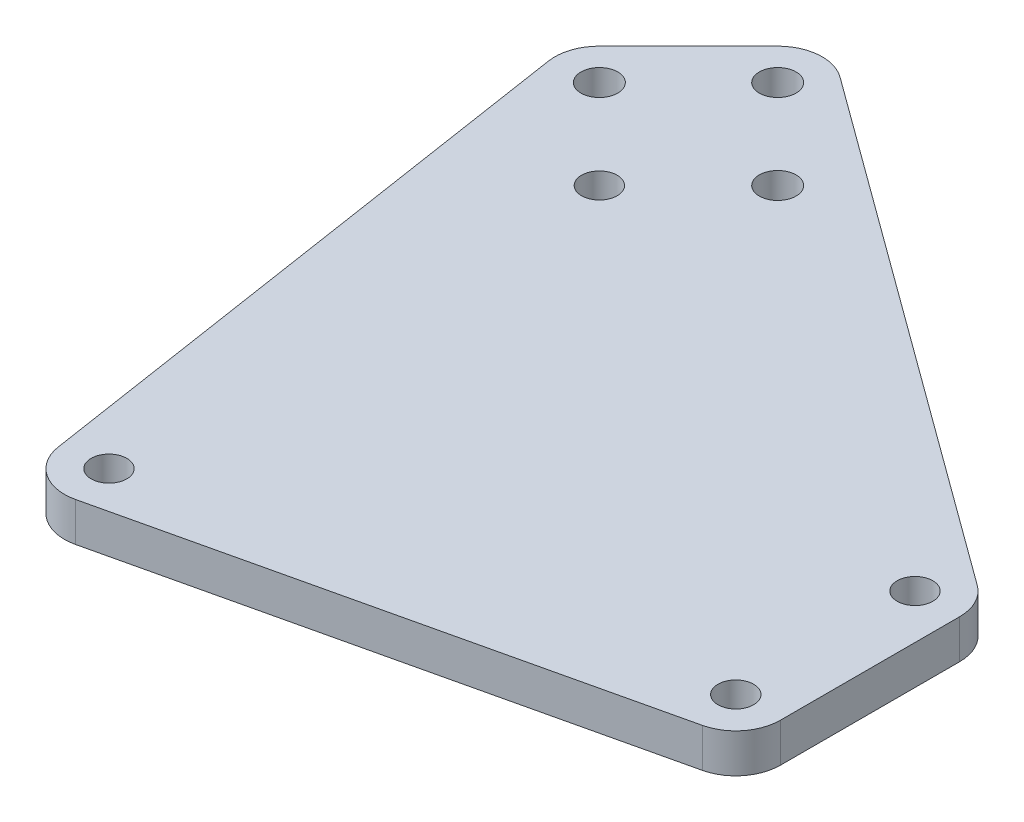
ISO-10303-21;
HEADER;
FILE_DESCRIPTION(('STEP AP214'),'2;1');
FILE_NAME('part.step','',(''),(''),'','','');
FILE_SCHEMA(('AUTOMOTIVE_DESIGN { 1 0 10303 214 1 1 1 1 }'));
ENDSEC;
DATA;
#1=APPLICATION_CONTEXT('core data for automotive mechanical design processes');
#2=APPLICATION_PROTOCOL_DEFINITION('international standard','automotive_design',2000,#1);
#3=PRODUCT_CONTEXT('',#1,'mechanical');
#4=PRODUCT('Part','Part','',(#3));
#5=PRODUCT_RELATED_PRODUCT_CATEGORY('part','',(#4));
#6=PRODUCT_DEFINITION_FORMATION('','',#4);
#7=PRODUCT_DEFINITION_CONTEXT('part definition',#1,'design');
#8=PRODUCT_DEFINITION('design','',#6,#7);
#9=PRODUCT_DEFINITION_SHAPE('','',#8);
#10=(LENGTH_UNIT() NAMED_UNIT(*) SI_UNIT(.MILLI.,.METRE.));
#11=(NAMED_UNIT(*) PLANE_ANGLE_UNIT() SI_UNIT($,.RADIAN.));
#12=(NAMED_UNIT(*) SI_UNIT($,.STERADIAN.) SOLID_ANGLE_UNIT());
#13=UNCERTAINTY_MEASURE_WITH_UNIT(LENGTH_MEASURE(1.E-05),#10,'distance_accuracy_value','');
#14=(GEOMETRIC_REPRESENTATION_CONTEXT(3) GLOBAL_UNCERTAINTY_ASSIGNED_CONTEXT((#13)) GLOBAL_UNIT_ASSIGNED_CONTEXT((#10,
#11,#12)) REPRESENTATION_CONTEXT('',''));
#15=CARTESIAN_POINT('',(0.,0.,0.));
#16=DIRECTION('',(0.,0.,1.));
#17=DIRECTION('',(1.,0.,0.));
#18=AXIS2_PLACEMENT_3D('',#15,#16,#17);
#19=CARTESIAN_POINT('',(8348.96943647229,3.5,-3114.41158300691));
#20=DIRECTION('',(0.,1.,0.));
#21=DIRECTION('',(0.,0.,1.));
#22=AXIS2_PLACEMENT_3D('',#19,#20,#21);
#23=PLANE('',#22);
#24=CARTESIAN_POINT('',(8295.29784933292,3.5,-3139.76378876024));
#25=DIRECTION('',(0.,1.,0.));
#26=DIRECTION('',(0.,0.,1.));
#27=AXIS2_PLACEMENT_3D('',#24,#25,#26);
#28=CIRCLE('',#27,1.65000000000019);
#29=CARTESIAN_POINT('',(8295.29784933292,3.5,-3138.11378876024));
#30=VERTEX_POINT('',#29);
#31=EDGE_CURVE('E287',#30,#30,#28,.T.);
#32=ORIENTED_EDGE('',*,*,#31,.F.);
#33=EDGE_LOOP('',(#32));
#34=FACE_BOUND('',#33,.T.);
#35=CARTESIAN_POINT('',(8303.29784933292,3.5,-3131.76378876024));
#36=DIRECTION('',(0.,1.,0.));
#37=DIRECTION('',(0.,0.,1.));
#38=AXIS2_PLACEMENT_3D('',#35,#36,#37);
#39=CIRCLE('',#38,1.59999999999982);
#40=CARTESIAN_POINT('',(8303.29784933292,3.5,-3130.16378876024));
#41=VERTEX_POINT('',#40);
#42=EDGE_CURVE('E271',#41,#41,#39,.T.);
#43=ORIENTED_EDGE('',*,*,#42,.F.);
#44=EDGE_LOOP('',(#43));
#45=FACE_BOUND('',#44,.T.);
#46=CARTESIAN_POINT('',(8348.96943647229,3.5,-3098.33238226228));
#47=DIRECTION('',(0.,1.,0.));
#48=DIRECTION('',(0.,0.,1.));
#49=AXIS2_PLACEMENT_3D('',#46,#47,#48);
#50=CIRCLE('',#49,1.59999999999982);
#51=CARTESIAN_POINT('',(8348.96943647229,3.5,-3096.73238226228));
#52=VERTEX_POINT('',#51);
#53=EDGE_CURVE('E255',#52,#52,#50,.T.);
#54=ORIENTED_EDGE('',*,*,#53,.F.);
#55=EDGE_LOOP('',(#54));
#56=FACE_BOUND('',#55,.T.);
#57=CARTESIAN_POINT('',(8348.96943647229,3.5,-3114.41158300691));
#58=DIRECTION('',(0.,1.,0.));
#59=DIRECTION('',(0.,0.,1.));
#60=AXIS2_PLACEMENT_3D('',#57,#58,#59);
#61=CIRCLE('',#60,3.99999999999791);
#62=CARTESIAN_POINT('',(8352.96943647229,3.5,-3114.41158300691));
#63=VERTEX_POINT('',#62);
#64=CARTESIAN_POINT('',(8351.32843370685,3.5,-3117.64192850659));
#65=VERTEX_POINT('',#64);
#66=EDGE_CURVE('E188',#63,#65,#61,.T.);
#67=ORIENTED_EDGE('',*,*,#66,.T.);
#68=DIRECTION('',(-0.807586374921076,0.,-0.589749308640405));
#69=VECTOR('',#68,1.);
#70=CARTESIAN_POINT('',(8305.65684656748,3.5,-3150.99413425992));
#71=LINE('',#70,#69);
#72=CARTESIAN_POINT('',(8305.65684656748,3.5,-3150.99413425992));
#73=VERTEX_POINT('',#72);
#74=EDGE_CURVE('E112',#65,#73,#71,.T.);
#75=ORIENTED_EDGE('',*,*,#74,.T.);
#76=CARTESIAN_POINT('',(8303.29784933292,3.5,-3147.76378876024));
#77=DIRECTION('',(0.,1.,0.));
#78=DIRECTION('',(0.,0.,1.));
#79=AXIS2_PLACEMENT_3D('',#76,#77,#78);
#80=CIRCLE('',#79,4.00000000000042);
#81=CARTESIAN_POINT('',(8300.46942220818,3.5,-3150.59221588498));
#82=VERTEX_POINT('',#81);
#83=EDGE_CURVE('E217',#73,#82,#80,.T.);
#84=ORIENTED_EDGE('',*,*,#83,.T.);
#85=DIRECTION('',(-0.707106781186469,0.,0.707106781186626));
#86=VECTOR('',#85,1.);
#87=CARTESIAN_POINT('',(8292.46942220817,3.5,-3142.59221588498));
#88=LINE('',#87,#86);
#89=CARTESIAN_POINT('',(8292.46942220817,3.5,-3142.59221588498));
#90=VERTEX_POINT('',#89);
#91=EDGE_CURVE('E237',#82,#90,#88,.T.);
#92=ORIENTED_EDGE('',*,*,#91,.T.);
#93=CARTESIAN_POINT('',(8295.29784933292,3.5,-3139.76378876024));
#94=DIRECTION('',(0.,1.,0.));
#95=DIRECTION('',(0.,0.,1.));
#96=AXIS2_PLACEMENT_3D('',#93,#94,#95);
#97=CIRCLE('',#96,4.00000000000107);
#98=CARTESIAN_POINT('',(8291.34436254232,3.5,-3139.15556002322));
#99=VERTEX_POINT('',#98);
#100=EDGE_CURVE('E233',#90,#99,#97,.T.);
#101=ORIENTED_EDGE('',*,*,#100,.T.);
#102=DIRECTION('',(0.152057184253925,0.,0.98837169765062));
#103=VECTOR('',#102,1.);
#104=CARTESIAN_POINT('',(8291.34436254232,3.5,-3139.15556002322));
#105=LINE('',#104,#103);
#106=CARTESIAN_POINT('',(8299.34436254232,3.5,-3087.15556002322));
#107=VERTEX_POINT('',#106);
#108=EDGE_CURVE('E236',#99,#107,#105,.T.);
#109=ORIENTED_EDGE('',*,*,#108,.T.);
#110=CARTESIAN_POINT('',(8303.29784933292,3.5,-3087.76378876024));
#111=DIRECTION('',(0.,1.,0.));
#112=DIRECTION('',(0.,0.,1.));
#113=AXIS2_PLACEMENT_3D('',#110,#111,#112);
#114=CIRCLE('',#113,4.00000000000045);
#115=CARTESIAN_POINT('',(8304.19963628055,3.5,-3083.86676678171));
#116=VERTEX_POINT('',#115);
#117=EDGE_CURVE('E137',#107,#116,#114,.T.);
#118=ORIENTED_EDGE('',*,*,#117,.T.);
#119=DIRECTION('',(0.974255494630878,0.,-0.225446736905954));
#120=VECTOR('',#119,1.);
#121=CARTESIAN_POINT('',(8304.19963628055,3.5,-3083.86676678171));
#122=LINE('',#121,#120);
#123=CARTESIAN_POINT('',(8349.87122341991,3.5,-3094.43536028376));
#124=VERTEX_POINT('',#123);
#125=EDGE_CURVE('E131',#116,#124,#122,.T.);
#126=ORIENTED_EDGE('',*,*,#125,.T.);
#127=CARTESIAN_POINT('',(8348.96943647229,3.5,-3098.33238226228));
#128=DIRECTION('',(0.,1.,0.));
#129=DIRECTION('',(0.,0.,1.));
#130=AXIS2_PLACEMENT_3D('',#127,#128,#129);
#131=CIRCLE('',#130,3.9999999999997);
#132=CARTESIAN_POINT('',(8352.96943647229,3.5,-3098.33238226228));
#133=VERTEX_POINT('',#132);
#134=EDGE_CURVE('E135',#124,#133,#131,.T.);
#135=ORIENTED_EDGE('',*,*,#134,.T.);
#136=DIRECTION('',(0.,0.,-1.));
#137=VECTOR('',#136,1.);
#138=CARTESIAN_POINT('',(8352.96943647229,3.5,-3098.33238226228));
#139=LINE('',#138,#137);
#140=EDGE_CURVE('E63',#133,#63,#139,.T.);
#141=ORIENTED_EDGE('',*,*,#140,.T.);
#142=EDGE_LOOP('',(#67,#75,#84,#92,#101,#109,#118,#126,#135,#141));
#143=FACE_BOUND('',#142,.T.);
#144=CARTESIAN_POINT('',(8303.29784933292,3.5,-3147.76378876024));
#145=DIRECTION('',(0.,1.,0.));
#146=DIRECTION('',(0.,0.,1.));
#147=AXIS2_PLACEMENT_3D('',#144,#145,#146);
#148=CIRCLE('',#147,1.65000000000019);
#149=CARTESIAN_POINT('',(8303.29784933292,3.5,-3146.11378876024));
#150=VERTEX_POINT('',#149);
#151=EDGE_CURVE('E164',#150,#150,#148,.T.);
#152=ORIENTED_EDGE('',*,*,#151,.F.);
#153=EDGE_LOOP('',(#152));
#154=FACE_BOUND('',#153,.T.);
#155=CARTESIAN_POINT('',(8348.96943647229,3.5,-3114.41158300691));
#156=DIRECTION('',(0.,1.,0.));
#157=DIRECTION('',(0.,0.,1.));
#158=AXIS2_PLACEMENT_3D('',#155,#156,#157);
#159=CIRCLE('',#158,1.59999999999982);
#160=CARTESIAN_POINT('',(8348.96943647229,3.5,-3112.81158300691));
#161=VERTEX_POINT('',#160);
#162=EDGE_CURVE('E263',#161,#161,#159,.T.);
#163=ORIENTED_EDGE('',*,*,#162,.F.);
#164=EDGE_LOOP('',(#163));
#165=FACE_BOUND('',#164,.T.);
#166=CARTESIAN_POINT('',(8303.29784933292,3.5,-3087.76378876024));
#167=DIRECTION('',(0.,1.,0.));
#168=DIRECTION('',(0.,0.,1.));
#169=AXIS2_PLACEMENT_3D('',#166,#167,#168);
#170=CIRCLE('',#169,1.59999999999982);
#171=CARTESIAN_POINT('',(8303.29784933292,3.5,-3086.16378876024));
#172=VERTEX_POINT('',#171);
#173=EDGE_CURVE('E279',#172,#172,#170,.T.);
#174=ORIENTED_EDGE('',*,*,#173,.F.);
#175=EDGE_LOOP('',(#174));
#176=FACE_BOUND('',#175,.T.);
#177=CARTESIAN_POINT('',(8311.29784933292,3.5,-3139.76378876024));
#178=DIRECTION('',(0.,1.,0.));
#179=DIRECTION('',(0.,0.,1.));
#180=AXIS2_PLACEMENT_3D('',#177,#178,#179);
#181=CIRCLE('',#180,1.65000000000019);
#182=CARTESIAN_POINT('',(8311.29784933292,3.5,-3138.11378876024));
#183=VERTEX_POINT('',#182);
#184=EDGE_CURVE('E295',#183,#183,#181,.T.);
#185=ORIENTED_EDGE('',*,*,#184,.F.);
#186=EDGE_LOOP('',(#185));
#187=FACE_BOUND('',#186,.T.);
#188=ADVANCED_FACE('F45',(#34,#45,#56,#143,#154,#165,#176,#187),#23,.T.);
#189=CARTESIAN_POINT('',(8348.96943647229,0.,-3114.41158300691));
#190=DIRECTION('',(0.,1.,0.));
#191=DIRECTION('',(0.,0.,1.));
#192=AXIS2_PLACEMENT_3D('',#189,#190,#191);
#193=PLANE('',#192);
#194=CARTESIAN_POINT('',(8348.96943647229,0.,-3114.41158300691));
#195=DIRECTION('',(0.,1.,0.));
#196=DIRECTION('',(0.,0.,1.));
#197=AXIS2_PLACEMENT_3D('',#194,#195,#196);
#198=CIRCLE('',#197,3.99999999999791);
#199=CARTESIAN_POINT('',(8352.96943647229,0.,-3114.41158300691));
#200=VERTEX_POINT('',#199);
#201=CARTESIAN_POINT('',(8351.32843370685,0.,-3117.64192850659));
#202=VERTEX_POINT('',#201);
#203=EDGE_CURVE('E159',#200,#202,#198,.T.);
#204=ORIENTED_EDGE('',*,*,#203,.F.);
#205=DIRECTION('',(0.,0.,-1.));
#206=VECTOR('',#205,1.);
#207=CARTESIAN_POINT('',(8352.96943647229,0.,-3098.33238226228));
#208=LINE('',#207,#206);
#209=CARTESIAN_POINT('',(8352.96943647229,0.,-3098.33238226228));
#210=VERTEX_POINT('',#209);
#211=EDGE_CURVE('E104',#210,#200,#208,.T.);
#212=ORIENTED_EDGE('',*,*,#211,.F.);
#213=CARTESIAN_POINT('',(8348.96943647229,0.,-3098.33238226228));
#214=DIRECTION('',(0.,1.,0.));
#215=DIRECTION('',(0.,0.,1.));
#216=AXIS2_PLACEMENT_3D('',#213,#214,#215);
#217=CIRCLE('',#216,3.9999999999997);
#218=CARTESIAN_POINT('',(8349.87122341991,0.,-3094.43536028376));
#219=VERTEX_POINT('',#218);
#220=EDGE_CURVE('E98',#219,#210,#217,.T.);
#221=ORIENTED_EDGE('',*,*,#220,.F.);
#222=DIRECTION('',(0.974255494630878,0.,-0.225446736905954));
#223=VECTOR('',#222,1.);
#224=CARTESIAN_POINT('',(8304.19963628055,0.,-3083.86676678171));
#225=LINE('',#224,#223);
#226=CARTESIAN_POINT('',(8304.19963628055,0.,-3083.86676678171));
#227=VERTEX_POINT('',#226);
#228=EDGE_CURVE('E146',#227,#219,#225,.T.);
#229=ORIENTED_EDGE('',*,*,#228,.F.);
#230=CARTESIAN_POINT('',(8303.29784933292,0.,-3087.76378876024));
#231=DIRECTION('',(0.,1.,0.));
#232=DIRECTION('',(0.,0.,1.));
#233=AXIS2_PLACEMENT_3D('',#230,#231,#232);
#234=CIRCLE('',#233,4.00000000000045);
#235=CARTESIAN_POINT('',(8299.34436254232,0.,-3087.15556002322));
#236=VERTEX_POINT('',#235);
#237=EDGE_CURVE('E179',#236,#227,#234,.T.);
#238=ORIENTED_EDGE('',*,*,#237,.F.);
#239=DIRECTION('',(0.152057184253925,0.,0.98837169765062));
#240=VECTOR('',#239,1.);
#241=CARTESIAN_POINT('',(8291.34436254232,0.,-3139.15556002322));
#242=LINE('',#241,#240);
#243=CARTESIAN_POINT('',(8291.34436254232,0.,-3139.15556002322));
#244=VERTEX_POINT('',#243);
#245=EDGE_CURVE('E176',#244,#236,#242,.T.);
#246=ORIENTED_EDGE('',*,*,#245,.F.);
#247=CARTESIAN_POINT('',(8295.29784933292,0.,-3139.76378876024));
#248=DIRECTION('',(0.,1.,0.));
#249=DIRECTION('',(0.,0.,1.));
#250=AXIS2_PLACEMENT_3D('',#247,#248,#249);
#251=CIRCLE('',#250,4.00000000000107);
#252=CARTESIAN_POINT('',(8292.46942220817,0.,-3142.59221588498));
#253=VERTEX_POINT('',#252);
#254=EDGE_CURVE('E173',#253,#244,#251,.T.);
#255=ORIENTED_EDGE('',*,*,#254,.F.);
#256=DIRECTION('',(-0.707106781186469,0.,0.707106781186626));
#257=VECTOR('',#256,1.);
#258=CARTESIAN_POINT('',(8292.46942220817,0.,-3142.59221588498));
#259=LINE('',#258,#257);
#260=CARTESIAN_POINT('',(8300.46942220818,0.,-3150.59221588498));
#261=VERTEX_POINT('',#260);
#262=EDGE_CURVE('E170',#261,#253,#259,.T.);
#263=ORIENTED_EDGE('',*,*,#262,.F.);
#264=CARTESIAN_POINT('',(8303.29784933292,0.,-3147.76378876024));
#265=DIRECTION('',(0.,1.,0.));
#266=DIRECTION('',(0.,0.,1.));
#267=AXIS2_PLACEMENT_3D('',#264,#265,#266);
#268=CIRCLE('',#267,4.00000000000042);
#269=CARTESIAN_POINT('',(8305.65684656748,0.,-3150.99413425992));
#270=VERTEX_POINT('',#269);
#271=EDGE_CURVE('E167',#270,#261,#268,.T.);
#272=ORIENTED_EDGE('',*,*,#271,.F.);
#273=DIRECTION('',(-0.807586374921076,0.,-0.589749308640405));
#274=VECTOR('',#273,1.);
#275=CARTESIAN_POINT('',(8305.65684656748,0.,-3150.99413425992));
#276=LINE('',#275,#274);
#277=EDGE_CURVE('E163',#202,#270,#276,.T.);
#278=ORIENTED_EDGE('',*,*,#277,.F.);
#279=EDGE_LOOP('',(#204,#212,#221,#229,#238,#246,#255,#263,#272,#278));
#280=FACE_BOUND('',#279,.T.);
#281=CARTESIAN_POINT('',(8303.29784933292,0.,-3147.76378876024));
#282=DIRECTION('',(0.,1.,0.));
#283=DIRECTION('',(0.,0.,1.));
#284=AXIS2_PLACEMENT_3D('',#281,#282,#283);
#285=CIRCLE('',#284,1.65000000000019);
#286=CARTESIAN_POINT('',(8303.29784933292,0.,-3146.11378876024));
#287=VERTEX_POINT('',#286);
#288=EDGE_CURVE('E251',#287,#287,#285,.T.);
#289=ORIENTED_EDGE('',*,*,#288,.T.);
#290=EDGE_LOOP('',(#289));
#291=FACE_BOUND('',#290,.T.);
#292=CARTESIAN_POINT('',(8348.96943647229,0.,-3098.33238226228));
#293=DIRECTION('',(0.,1.,0.));
#294=DIRECTION('',(0.,0.,1.));
#295=AXIS2_PLACEMENT_3D('',#292,#293,#294);
#296=CIRCLE('',#295,1.59999999999982);
#297=CARTESIAN_POINT('',(8348.96943647229,0.,-3096.73238226228));
#298=VERTEX_POINT('',#297);
#299=EDGE_CURVE('E259',#298,#298,#296,.T.);
#300=ORIENTED_EDGE('',*,*,#299,.T.);
#301=EDGE_LOOP('',(#300));
#302=FACE_BOUND('',#301,.T.);
#303=CARTESIAN_POINT('',(8348.96943647229,0.,-3114.41158300691));
#304=DIRECTION('',(0.,1.,0.));
#305=DIRECTION('',(0.,0.,1.));
#306=AXIS2_PLACEMENT_3D('',#303,#304,#305);
#307=CIRCLE('',#306,1.59999999999982);
#308=CARTESIAN_POINT('',(8348.96943647229,0.,-3112.81158300691));
#309=VERTEX_POINT('',#308);
#310=EDGE_CURVE('E267',#309,#309,#307,.T.);
#311=ORIENTED_EDGE('',*,*,#310,.T.);
#312=EDGE_LOOP('',(#311));
#313=FACE_BOUND('',#312,.T.);
#314=CARTESIAN_POINT('',(8303.29784933292,0.,-3131.76378876024));
#315=DIRECTION('',(0.,1.,0.));
#316=DIRECTION('',(0.,0.,1.));
#317=AXIS2_PLACEMENT_3D('',#314,#315,#316);
#318=CIRCLE('',#317,1.59999999999982);
#319=CARTESIAN_POINT('',(8303.29784933292,0.,-3130.16378876024));
#320=VERTEX_POINT('',#319);
#321=EDGE_CURVE('E275',#320,#320,#318,.T.);
#322=ORIENTED_EDGE('',*,*,#321,.T.);
#323=EDGE_LOOP('',(#322));
#324=FACE_BOUND('',#323,.T.);
#325=CARTESIAN_POINT('',(8303.29784933292,0.,-3087.76378876024));
#326=DIRECTION('',(0.,1.,0.));
#327=DIRECTION('',(0.,0.,1.));
#328=AXIS2_PLACEMENT_3D('',#325,#326,#327);
#329=CIRCLE('',#328,1.59999999999982);
#330=CARTESIAN_POINT('',(8303.29784933292,0.,-3086.16378876024));
#331=VERTEX_POINT('',#330);
#332=EDGE_CURVE('E283',#331,#331,#329,.T.);
#333=ORIENTED_EDGE('',*,*,#332,.T.);
#334=EDGE_LOOP('',(#333));
#335=FACE_BOUND('',#334,.T.);
#336=CARTESIAN_POINT('',(8295.29784933292,0.,-3139.76378876024));
#337=DIRECTION('',(0.,1.,0.));
#338=DIRECTION('',(0.,0.,1.));
#339=AXIS2_PLACEMENT_3D('',#336,#337,#338);
#340=CIRCLE('',#339,1.65000000000019);
#341=CARTESIAN_POINT('',(8295.29784933292,0.,-3138.11378876024));
#342=VERTEX_POINT('',#341);
#343=EDGE_CURVE('E291',#342,#342,#340,.T.);
#344=ORIENTED_EDGE('',*,*,#343,.T.);
#345=EDGE_LOOP('',(#344));
#346=FACE_BOUND('',#345,.T.);
#347=CARTESIAN_POINT('',(8311.29784933292,0.,-3139.76378876024));
#348=DIRECTION('',(0.,1.,0.));
#349=DIRECTION('',(0.,0.,1.));
#350=AXIS2_PLACEMENT_3D('',#347,#348,#349);
#351=CIRCLE('',#350,1.65000000000019);
#352=CARTESIAN_POINT('',(8311.29784933292,0.,-3138.11378876024));
#353=VERTEX_POINT('',#352);
#354=EDGE_CURVE('E299',#353,#353,#351,.T.);
#355=ORIENTED_EDGE('',*,*,#354,.T.);
#356=EDGE_LOOP('',(#355));
#357=FACE_BOUND('',#356,.T.);
#358=ADVANCED_FACE('F221',(#280,#291,#302,#313,#324,#335,#346,#357),#193,.F.);
#359=CARTESIAN_POINT('',(8348.96943647229,3.5,-3114.41158300691));
#360=DIRECTION('',(0.,-1.,0.));
#361=DIRECTION('',(0.,0.,-1.));
#362=AXIS2_PLACEMENT_3D('',#359,#360,#361);
#363=CYLINDRICAL_SURFACE('',#362,3.99999999999791);
#364=ORIENTED_EDGE('',*,*,#203,.T.);
#365=DIRECTION('',(0.,-1.,0.));
#366=VECTOR('',#365,1.);
#367=CARTESIAN_POINT('',(8351.32843370685,3.5,-3117.64192850659));
#368=LINE('',#367,#366);
#369=EDGE_CURVE('E11',#65,#202,#368,.T.);
#370=ORIENTED_EDGE('',*,*,#369,.F.);
#371=ORIENTED_EDGE('',*,*,#66,.F.);
#372=DIRECTION('',(0.,-1.,0.));
#373=VECTOR('',#372,1.);
#374=CARTESIAN_POINT('',(8352.96943647229,3.5,-3114.41158300691));
#375=LINE('',#374,#373);
#376=EDGE_CURVE('E155',#63,#200,#375,.T.);
#377=ORIENTED_EDGE('',*,*,#376,.T.);
#378=EDGE_LOOP('',(#364,#370,#371,#377));
#379=FACE_BOUND('',#378,.T.);
#380=ADVANCED_FACE('F47',(#379),#363,.T.);
#381=CARTESIAN_POINT('',(8305.65684656748,3.5,-3150.99413425992));
#382=DIRECTION('',(-0.589749308640405,0.,0.807586374921076));
#383=DIRECTION('',(0.807586374921076,0.,0.589749308640405));
#384=AXIS2_PLACEMENT_3D('',#381,#382,#383);
#385=PLANE('',#384);
#386=ORIENTED_EDGE('',*,*,#277,.T.);
#387=DIRECTION('',(0.,-1.,0.));
#388=VECTOR('',#387,1.);
#389=CARTESIAN_POINT('',(8305.65684656748,3.5,-3150.99413425992));
#390=LINE('',#389,#388);
#391=EDGE_CURVE('E55',#73,#270,#390,.T.);
#392=ORIENTED_EDGE('',*,*,#391,.F.);
#393=ORIENTED_EDGE('',*,*,#74,.F.);
#394=ORIENTED_EDGE('',*,*,#369,.T.);
#395=EDGE_LOOP('',(#386,#392,#393,#394));
#396=FACE_BOUND('',#395,.T.);
#397=ADVANCED_FACE('F343',(#396),#385,.F.);
#398=CARTESIAN_POINT('',(8303.29784933292,3.5,-3147.76378876024));
#399=DIRECTION('',(0.,-1.,0.));
#400=DIRECTION('',(0.,0.,-1.));
#401=AXIS2_PLACEMENT_3D('',#398,#399,#400);
#402=CYLINDRICAL_SURFACE('',#401,4.00000000000042);
#403=ORIENTED_EDGE('',*,*,#271,.T.);
#404=DIRECTION('',(0.,-1.,0.));
#405=VECTOR('',#404,1.);
#406=CARTESIAN_POINT('',(8300.46942220818,3.5,-3150.59221588498));
#407=LINE('',#406,#405);
#408=EDGE_CURVE('E207',#82,#261,#407,.T.);
#409=ORIENTED_EDGE('',*,*,#408,.F.);
#410=ORIENTED_EDGE('',*,*,#83,.F.);
#411=ORIENTED_EDGE('',*,*,#391,.T.);
#412=EDGE_LOOP('',(#403,#409,#410,#411));
#413=FACE_BOUND('',#412,.T.);
#414=ADVANCED_FACE('F215',(#413),#402,.T.);
#415=CARTESIAN_POINT('',(8292.46942220817,3.5,-3142.59221588498));
#416=DIRECTION('',(0.707106781186626,0.,0.707106781186469));
#417=DIRECTION('',(0.707106781186469,0.,-0.707106781186626));
#418=AXIS2_PLACEMENT_3D('',#415,#416,#417);
#419=PLANE('',#418);
#420=ORIENTED_EDGE('',*,*,#262,.T.);
#421=DIRECTION('',(0.,-1.,0.));
#422=VECTOR('',#421,1.);
#423=CARTESIAN_POINT('',(8292.46942220817,3.5,-3142.59221588498));
#424=LINE('',#423,#422);
#425=EDGE_CURVE('E203',#90,#253,#424,.T.);
#426=ORIENTED_EDGE('',*,*,#425,.F.);
#427=ORIENTED_EDGE('',*,*,#91,.F.);
#428=ORIENTED_EDGE('',*,*,#408,.T.);
#429=EDGE_LOOP('',(#420,#426,#427,#428));
#430=FACE_BOUND('',#429,.T.);
#431=ADVANCED_FACE('F227',(#430),#419,.F.);
#432=CARTESIAN_POINT('',(8295.29784933292,3.5,-3139.76378876024));
#433=DIRECTION('',(0.,-1.,0.));
#434=DIRECTION('',(0.,0.,-1.));
#435=AXIS2_PLACEMENT_3D('',#432,#433,#434);
#436=CYLINDRICAL_SURFACE('',#435,4.00000000000107);
#437=ORIENTED_EDGE('',*,*,#254,.T.);
#438=DIRECTION('',(0.,-1.,0.));
#439=VECTOR('',#438,1.);
#440=CARTESIAN_POINT('',(8291.34436254232,3.5,-3139.15556002322));
#441=LINE('',#440,#439);
#442=EDGE_CURVE('E199',#99,#244,#441,.T.);
#443=ORIENTED_EDGE('',*,*,#442,.F.);
#444=ORIENTED_EDGE('',*,*,#100,.F.);
#445=ORIENTED_EDGE('',*,*,#425,.T.);
#446=EDGE_LOOP('',(#437,#443,#444,#445));
#447=FACE_BOUND('',#446,.T.);
#448=ADVANCED_FACE('F231',(#447),#436,.T.);
#449=CARTESIAN_POINT('',(8291.34436254232,3.5,-3139.15556002322));
#450=DIRECTION('',(0.98837169765062,0.,-0.152057184253925));
#451=DIRECTION('',(-0.152057184253925,0.,-0.98837169765062));
#452=AXIS2_PLACEMENT_3D('',#449,#450,#451);
#453=PLANE('',#452);
#454=ORIENTED_EDGE('',*,*,#245,.T.);
#455=DIRECTION('',(0.,-1.,0.));
#456=VECTOR('',#455,1.);
#457=CARTESIAN_POINT('',(8299.34436254232,3.5,-3087.15556002322));
#458=LINE('',#457,#456);
#459=EDGE_CURVE('E195',#107,#236,#458,.T.);
#460=ORIENTED_EDGE('',*,*,#459,.F.);
#461=ORIENTED_EDGE('',*,*,#108,.F.);
#462=ORIENTED_EDGE('',*,*,#442,.T.);
#463=EDGE_LOOP('',(#454,#460,#461,#462));
#464=FACE_BOUND('',#463,.T.);
#465=ADVANCED_FACE('F333',(#464),#453,.F.);
#466=CARTESIAN_POINT('',(8303.29784933292,3.5,-3087.76378876024));
#467=DIRECTION('',(0.,-1.,0.));
#468=DIRECTION('',(0.,0.,-1.));
#469=AXIS2_PLACEMENT_3D('',#466,#467,#468);
#470=CYLINDRICAL_SURFACE('',#469,4.00000000000045);
#471=ORIENTED_EDGE('',*,*,#237,.T.);
#472=DIRECTION('',(0.,-1.,0.));
#473=VECTOR('',#472,1.);
#474=CARTESIAN_POINT('',(8304.19963628055,3.5,-3083.86676678171));
#475=LINE('',#474,#473);
#476=EDGE_CURVE('E148',#116,#227,#475,.T.);
#477=ORIENTED_EDGE('',*,*,#476,.F.);
#478=ORIENTED_EDGE('',*,*,#117,.F.);
#479=ORIENTED_EDGE('',*,*,#459,.T.);
#480=EDGE_LOOP('',(#471,#477,#478,#479));
#481=FACE_BOUND('',#480,.T.);
#482=ADVANCED_FACE('F330',(#481),#470,.T.);
#483=CARTESIAN_POINT('',(8304.19963628055,3.5,-3083.86676678171));
#484=DIRECTION('',(-0.225446736905954,0.,-0.974255494630878));
#485=DIRECTION('',(-0.974255494630878,0.,0.225446736905954));
#486=AXIS2_PLACEMENT_3D('',#483,#484,#485);
#487=PLANE('',#486);
#488=ORIENTED_EDGE('',*,*,#228,.T.);
#489=DIRECTION('',(0.,-1.,0.));
#490=VECTOR('',#489,1.);
#491=CARTESIAN_POINT('',(8349.87122341991,3.5,-3094.43536028376));
#492=LINE('',#491,#490);
#493=EDGE_CURVE('E143',#124,#219,#492,.T.);
#494=ORIENTED_EDGE('',*,*,#493,.F.);
#495=ORIENTED_EDGE('',*,*,#125,.F.);
#496=ORIENTED_EDGE('',*,*,#476,.T.);
#497=EDGE_LOOP('',(#488,#494,#495,#496));
#498=FACE_BOUND('',#497,.T.);
#499=ADVANCED_FACE('F144',(#498),#487,.F.);
#500=CARTESIAN_POINT('',(8348.96943647229,3.5,-3098.33238226228));
#501=DIRECTION('',(0.,-1.,0.));
#502=DIRECTION('',(0.,0.,-1.));
#503=AXIS2_PLACEMENT_3D('',#500,#501,#502);
#504=CYLINDRICAL_SURFACE('',#503,3.9999999999997);
#505=ORIENTED_EDGE('',*,*,#220,.T.);
#506=DIRECTION('',(0.,-1.,0.));
#507=VECTOR('',#506,1.);
#508=CARTESIAN_POINT('',(8352.96943647229,3.5,-3098.33238226228));
#509=LINE('',#508,#507);
#510=EDGE_CURVE('E149',#133,#210,#509,.T.);
#511=ORIENTED_EDGE('',*,*,#510,.F.);
#512=ORIENTED_EDGE('',*,*,#134,.F.);
#513=ORIENTED_EDGE('',*,*,#493,.T.);
#514=EDGE_LOOP('',(#505,#511,#512,#513));
#515=FACE_BOUND('',#514,.T.);
#516=ADVANCED_FACE('F151',(#515),#504,.T.);
#517=CARTESIAN_POINT('',(8352.96943647229,3.5,-3098.33238226228));
#518=DIRECTION('',(-1.,0.,0.));
#519=DIRECTION('',(0.,0.,1.));
#520=AXIS2_PLACEMENT_3D('',#517,#518,#519);
#521=PLANE('',#520);
#522=ORIENTED_EDGE('',*,*,#211,.T.);
#523=ORIENTED_EDGE('',*,*,#376,.F.);
#524=ORIENTED_EDGE('',*,*,#140,.F.);
#525=ORIENTED_EDGE('',*,*,#510,.T.);
#526=EDGE_LOOP('',(#522,#523,#524,#525));
#527=FACE_BOUND('',#526,.T.);
#528=ADVANCED_FACE('F323',(#527),#521,.F.);
#529=CARTESIAN_POINT('',(8303.29784933292,3.5,-3147.76378876024));
#530=DIRECTION('',(0.,-1.,0.));
#531=DIRECTION('',(0.,0.,-1.));
#532=AXIS2_PLACEMENT_3D('',#529,#530,#531);
#533=CYLINDRICAL_SURFACE('',#532,1.65000000000019);
#534=ORIENTED_EDGE('',*,*,#151,.T.);
#535=EDGE_LOOP('',(#534));
#536=FACE_BOUND('',#535,.T.);
#537=ORIENTED_EDGE('',*,*,#288,.F.);
#538=EDGE_LOOP('',(#537));
#539=FACE_BOUND('',#538,.T.);
#540=ADVANCED_FACE('F320',(#536,#539),#533,.F.);
#541=CARTESIAN_POINT('',(8348.96943647229,3.5,-3098.33238226228));
#542=DIRECTION('',(0.,-1.,0.));
#543=DIRECTION('',(0.,0.,-1.));
#544=AXIS2_PLACEMENT_3D('',#541,#542,#543);
#545=CYLINDRICAL_SURFACE('',#544,1.59999999999982);
#546=ORIENTED_EDGE('',*,*,#53,.T.);
#547=EDGE_LOOP('',(#546));
#548=FACE_BOUND('',#547,.T.);
#549=ORIENTED_EDGE('',*,*,#299,.F.);
#550=EDGE_LOOP('',(#549));
#551=FACE_BOUND('',#550,.T.);
#552=ADVANCED_FACE('F418',(#548,#551),#545,.F.);
#553=CARTESIAN_POINT('',(8348.96943647229,3.5,-3114.41158300691));
#554=DIRECTION('',(0.,-1.,0.));
#555=DIRECTION('',(0.,0.,-1.));
#556=AXIS2_PLACEMENT_3D('',#553,#554,#555);
#557=CYLINDRICAL_SURFACE('',#556,1.59999999999982);
#558=ORIENTED_EDGE('',*,*,#162,.T.);
#559=EDGE_LOOP('',(#558));
#560=FACE_BOUND('',#559,.T.);
#561=ORIENTED_EDGE('',*,*,#310,.F.);
#562=EDGE_LOOP('',(#561));
#563=FACE_BOUND('',#562,.T.);
#564=ADVANCED_FACE('F426',(#560,#563),#557,.F.);
#565=CARTESIAN_POINT('',(8303.29784933292,3.5,-3131.76378876024));
#566=DIRECTION('',(0.,-1.,0.));
#567=DIRECTION('',(0.,0.,-1.));
#568=AXIS2_PLACEMENT_3D('',#565,#566,#567);
#569=CYLINDRICAL_SURFACE('',#568,1.59999999999982);
#570=ORIENTED_EDGE('',*,*,#42,.T.);
#571=EDGE_LOOP('',(#570));
#572=FACE_BOUND('',#571,.T.);
#573=ORIENTED_EDGE('',*,*,#321,.F.);
#574=EDGE_LOOP('',(#573));
#575=FACE_BOUND('',#574,.T.);
#576=ADVANCED_FACE('F434',(#572,#575),#569,.F.);
#577=CARTESIAN_POINT('',(8303.29784933292,3.5,-3087.76378876024));
#578=DIRECTION('',(0.,-1.,0.));
#579=DIRECTION('',(0.,0.,-1.));
#580=AXIS2_PLACEMENT_3D('',#577,#578,#579);
#581=CYLINDRICAL_SURFACE('',#580,1.59999999999982);
#582=ORIENTED_EDGE('',*,*,#173,.T.);
#583=EDGE_LOOP('',(#582));
#584=FACE_BOUND('',#583,.T.);
#585=ORIENTED_EDGE('',*,*,#332,.F.);
#586=EDGE_LOOP('',(#585));
#587=FACE_BOUND('',#586,.T.);
#588=ADVANCED_FACE('F443',(#584,#587),#581,.F.);
#589=CARTESIAN_POINT('',(8295.29784933292,3.5,-3139.76378876024));
#590=DIRECTION('',(0.,-1.,0.));
#591=DIRECTION('',(0.,0.,-1.));
#592=AXIS2_PLACEMENT_3D('',#589,#590,#591);
#593=CYLINDRICAL_SURFACE('',#592,1.65000000000019);
#594=ORIENTED_EDGE('',*,*,#31,.T.);
#595=EDGE_LOOP('',(#594));
#596=FACE_BOUND('',#595,.T.);
#597=ORIENTED_EDGE('',*,*,#343,.F.);
#598=EDGE_LOOP('',(#597));
#599=FACE_BOUND('',#598,.T.);
#600=ADVANCED_FACE('F452',(#596,#599),#593,.F.);
#601=CARTESIAN_POINT('',(8311.29784933292,3.5,-3139.76378876024));
#602=DIRECTION('',(0.,-1.,0.));
#603=DIRECTION('',(0.,0.,-1.));
#604=AXIS2_PLACEMENT_3D('',#601,#602,#603);
#605=CYLINDRICAL_SURFACE('',#604,1.65000000000019);
#606=ORIENTED_EDGE('',*,*,#184,.T.);
#607=EDGE_LOOP('',(#606));
#608=FACE_BOUND('',#607,.T.);
#609=ORIENTED_EDGE('',*,*,#354,.F.);
#610=EDGE_LOOP('',(#609));
#611=FACE_BOUND('',#610,.T.);
#612=ADVANCED_FACE('F307',(#608,#611),#605,.F.);
#613=CLOSED_SHELL('',(#188,#358,#380,#397,#414,#431,#448,#465,#482,#499,#516,#528,#540,#552,
#564,#576,#588,#600,#612));
#614=MANIFOLD_SOLID_BREP('B2',#613);
#615=ADVANCED_BREP_SHAPE_REPRESENTATION('',(#18,#614),#14);
#616=SHAPE_DEFINITION_REPRESENTATION(#9,#615);
ENDSEC;
END-ISO-10303-21;
